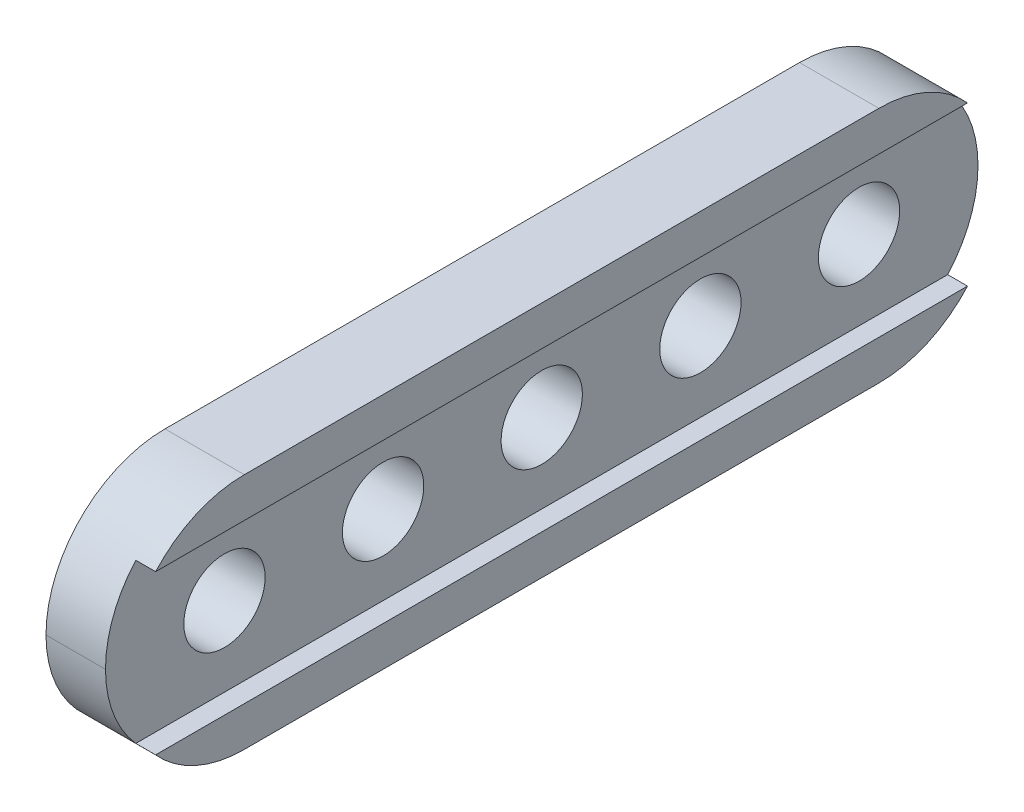
ISO-10303-21;
HEADER;
FILE_DESCRIPTION(('STEP AP214'),'2;1');
FILE_NAME('part.step','',(''),(''),'','','');
FILE_SCHEMA(('AUTOMOTIVE_DESIGN { 1 0 10303 214 1 1 1 1 }'));
ENDSEC;
DATA;
#1=APPLICATION_CONTEXT('core data for automotive mechanical design processes');
#2=APPLICATION_PROTOCOL_DEFINITION('international standard','automotive_design',2000,#1);
#3=PRODUCT_CONTEXT('',#1,'mechanical');
#4=PRODUCT('Part','Part','',(#3));
#5=PRODUCT_RELATED_PRODUCT_CATEGORY('part','',(#4));
#6=PRODUCT_DEFINITION_FORMATION('','',#4);
#7=PRODUCT_DEFINITION_CONTEXT('part definition',#1,'design');
#8=PRODUCT_DEFINITION('design','',#6,#7);
#9=PRODUCT_DEFINITION_SHAPE('','',#8);
#10=(LENGTH_UNIT() NAMED_UNIT(*) SI_UNIT(.MILLI.,.METRE.));
#11=(NAMED_UNIT(*) PLANE_ANGLE_UNIT() SI_UNIT($,.RADIAN.));
#12=(NAMED_UNIT(*) SI_UNIT($,.STERADIAN.) SOLID_ANGLE_UNIT());
#13=UNCERTAINTY_MEASURE_WITH_UNIT(LENGTH_MEASURE(1.E-05),#10,'distance_accuracy_value','');
#14=(GEOMETRIC_REPRESENTATION_CONTEXT(3) GLOBAL_UNCERTAINTY_ASSIGNED_CONTEXT((#13)) GLOBAL_UNIT_ASSIGNED_CONTEXT((#10,
#11,#12)) REPRESENTATION_CONTEXT('',''));
#15=CARTESIAN_POINT('',(0.,0.,0.));
#16=DIRECTION('',(0.,0.,1.));
#17=DIRECTION('',(1.,0.,0.));
#18=AXIS2_PLACEMENT_3D('',#15,#16,#17);
#19=CARTESIAN_POINT('',(4.,6.,-22.));
#20=DIRECTION('',(-1.,0.,0.));
#21=DIRECTION('',(0.,-1.,0.));
#22=AXIS2_PLACEMENT_3D('',#19,#20,#21);
#23=CYLINDRICAL_SURFACE('',#22,2.05);
#24=CARTESIAN_POINT('',(3.,6.,-22.));
#25=DIRECTION('',(1.,0.,0.));
#26=DIRECTION('',(0.,1.,0.));
#27=AXIS2_PLACEMENT_3D('',#24,#25,#26);
#28=CIRCLE('',#27,2.05);
#29=CARTESIAN_POINT('',(3.,8.05,-22.));
#30=VERTEX_POINT('',#29);
#31=EDGE_CURVE('E41',#30,#30,#28,.T.);
#32=ORIENTED_EDGE('',*,*,#31,.T.);
#33=EDGE_LOOP('',(#32));
#34=FACE_BOUND('',#33,.T.);
#35=CARTESIAN_POINT('',(0.,6.,-22.));
#36=DIRECTION('',(-1.,0.,0.));
#37=DIRECTION('',(0.,-1.,0.));
#38=AXIS2_PLACEMENT_3D('',#35,#36,#37);
#39=CIRCLE('',#38,2.05);
#40=CARTESIAN_POINT('',(0.,3.95,-22.));
#41=VERTEX_POINT('',#40);
#42=EDGE_CURVE('E11',#41,#41,#39,.T.);
#43=ORIENTED_EDGE('',*,*,#42,.T.);
#44=EDGE_LOOP('',(#43));
#45=FACE_BOUND('',#44,.T.);
#46=ADVANCED_FACE('F33',(#34,#45),#23,.F.);
#47=CARTESIAN_POINT('',(0.,0.,-44.));
#48=DIRECTION('',(-1.,0.,0.));
#49=DIRECTION('',(0.,-1.,0.));
#50=AXIS2_PLACEMENT_3D('',#47,#48,#49);
#51=PLANE('',#50);
#52=CARTESIAN_POINT('',(0.,6.,-14.));
#53=DIRECTION('',(1.,0.,0.));
#54=DIRECTION('',(0.,-1.,0.));
#55=AXIS2_PLACEMENT_3D('',#52,#53,#54);
#56=CIRCLE('',#55,2.05);
#57=CARTESIAN_POINT('',(0.,3.95,-14.));
#58=VERTEX_POINT('',#57);
#59=EDGE_CURVE('E194',#58,#58,#56,.T.);
#60=ORIENTED_EDGE('',*,*,#59,.T.);
#61=EDGE_LOOP('',(#60));
#62=FACE_BOUND('',#61,.T.);
#63=CARTESIAN_POINT('',(0.,6.,-6.));
#64=DIRECTION('',(1.,0.,0.));
#65=DIRECTION('',(0.,-1.,0.));
#66=AXIS2_PLACEMENT_3D('',#63,#64,#65);
#67=CIRCLE('',#66,2.05);
#68=CARTESIAN_POINT('',(0.,3.95,-6.));
#69=VERTEX_POINT('',#68);
#70=EDGE_CURVE('E183',#69,#69,#67,.T.);
#71=ORIENTED_EDGE('',*,*,#70,.T.);
#72=EDGE_LOOP('',(#71));
#73=FACE_BOUND('',#72,.T.);
#74=CARTESIAN_POINT('',(0.,6.,-30.));
#75=DIRECTION('',(-1.,0.,0.));
#76=DIRECTION('',(0.,-1.,0.));
#77=AXIS2_PLACEMENT_3D('',#74,#75,#76);
#78=CIRCLE('',#77,2.05);
#79=CARTESIAN_POINT('',(0.,3.95,-30.));
#80=VERTEX_POINT('',#79);
#81=EDGE_CURVE('E187',#80,#80,#78,.T.);
#82=ORIENTED_EDGE('',*,*,#81,.F.);
#83=EDGE_LOOP('',(#82));
#84=FACE_BOUND('',#83,.T.);
#85=CARTESIAN_POINT('',(0.,6.,-38.));
#86=DIRECTION('',(-1.,0.,0.));
#87=DIRECTION('',(0.,-1.,0.));
#88=AXIS2_PLACEMENT_3D('',#85,#86,#87);
#89=CIRCLE('',#88,2.05);
#90=CARTESIAN_POINT('',(0.,3.95,-38.));
#91=VERTEX_POINT('',#90);
#92=EDGE_CURVE('E178',#91,#91,#89,.T.);
#93=ORIENTED_EDGE('',*,*,#92,.F.);
#94=EDGE_LOOP('',(#93));
#95=FACE_BOUND('',#94,.T.);
#96=CARTESIAN_POINT('',(0.,6.,-6.));
#97=DIRECTION('',(-1.,0.,0.));
#98=DIRECTION('',(0.,-1.,0.));
#99=AXIS2_PLACEMENT_3D('',#96,#97,#98);
#100=CIRCLE('',#99,6.);
#101=CARTESIAN_POINT('',(0.,0.,-6.));
#102=VERTEX_POINT('',#101);
#103=CARTESIAN_POINT('',(0.,6.,0.));
#104=VERTEX_POINT('',#103);
#105=EDGE_CURVE('E114',#102,#104,#100,.T.);
#106=ORIENTED_EDGE('',*,*,#105,.T.);
#107=CARTESIAN_POINT('',(0.,6.,-6.));
#108=DIRECTION('',(-1.,0.,0.));
#109=DIRECTION('',(0.,-1.,0.));
#110=AXIS2_PLACEMENT_3D('',#107,#108,#109);
#111=CIRCLE('',#110,6.);
#112=CARTESIAN_POINT('',(0.,12.,-6.));
#113=VERTEX_POINT('',#112);
#114=EDGE_CURVE('E120',#104,#113,#111,.T.);
#115=ORIENTED_EDGE('',*,*,#114,.T.);
#116=DIRECTION('',(0.,0.,1.));
#117=VECTOR('',#116,1.);
#118=CARTESIAN_POINT('',(0.,12.,-44.));
#119=LINE('',#118,#117);
#120=CARTESIAN_POINT('',(0.,12.,-38.));
#121=VERTEX_POINT('',#120);
#122=EDGE_CURVE('E201',#121,#113,#119,.T.);
#123=ORIENTED_EDGE('',*,*,#122,.F.);
#124=CARTESIAN_POINT('',(0.,6.,-38.));
#125=DIRECTION('',(-1.,0.,0.));
#126=DIRECTION('',(0.,-1.,0.));
#127=AXIS2_PLACEMENT_3D('',#124,#125,#126);
#128=CIRCLE('',#127,6.);
#129=CARTESIAN_POINT('',(0.,6.,-44.));
#130=VERTEX_POINT('',#129);
#131=EDGE_CURVE('E203',#121,#130,#128,.T.);
#132=ORIENTED_EDGE('',*,*,#131,.T.);
#133=CARTESIAN_POINT('',(0.,6.,-38.));
#134=DIRECTION('',(-1.,0.,0.));
#135=DIRECTION('',(0.,-1.,0.));
#136=AXIS2_PLACEMENT_3D('',#133,#134,#135);
#137=CIRCLE('',#136,6.);
#138=CARTESIAN_POINT('',(0.,0.,-38.));
#139=VERTEX_POINT('',#138);
#140=EDGE_CURVE('E126',#130,#139,#137,.T.);
#141=ORIENTED_EDGE('',*,*,#140,.T.);
#142=DIRECTION('',(0.,0.,1.));
#143=VECTOR('',#142,1.);
#144=CARTESIAN_POINT('',(0.,0.,-44.));
#145=LINE('',#144,#143);
#146=EDGE_CURVE('E123',#139,#102,#145,.T.);
#147=ORIENTED_EDGE('',*,*,#146,.T.);
#148=EDGE_LOOP('',(#106,#115,#123,#132,#141,#147));
#149=FACE_BOUND('',#148,.T.);
#150=ORIENTED_EDGE('',*,*,#42,.F.);
#151=EDGE_LOOP('',(#150));
#152=FACE_BOUND('',#151,.T.);
#153=ADVANCED_FACE('F116',(#62,#73,#84,#95,#149,#152),#51,.T.);
#154=CARTESIAN_POINT('',(0.,12.,-44.));
#155=DIRECTION('',(0.,1.,0.));
#156=DIRECTION('',(0.,0.,1.));
#157=AXIS2_PLACEMENT_3D('',#154,#155,#156);
#158=PLANE('',#157);
#159=ORIENTED_EDGE('',*,*,#122,.T.);
#160=DIRECTION('',(-1.,0.,0.));
#161=VECTOR('',#160,1.);
#162=CARTESIAN_POINT('',(4.,12.,-6.));
#163=LINE('',#162,#161);
#164=CARTESIAN_POINT('',(4.,12.,-6.));
#165=VERTEX_POINT('',#164);
#166=EDGE_CURVE('E141',#113,#165,#163,.F.);
#167=ORIENTED_EDGE('',*,*,#166,.T.);
#168=DIRECTION('',(0.,0.,1.));
#169=VECTOR('',#168,1.);
#170=CARTESIAN_POINT('',(4.,12.,-44.));
#171=LINE('',#170,#169);
#172=CARTESIAN_POINT('',(4.,12.,-38.));
#173=VERTEX_POINT('',#172);
#174=EDGE_CURVE('E204',#173,#165,#171,.T.);
#175=ORIENTED_EDGE('',*,*,#174,.F.);
#176=DIRECTION('',(-1.,0.,0.));
#177=VECTOR('',#176,1.);
#178=CARTESIAN_POINT('',(0.,12.,-38.));
#179=LINE('',#178,#177);
#180=EDGE_CURVE('E142',#173,#121,#179,.T.);
#181=ORIENTED_EDGE('',*,*,#180,.T.);
#182=EDGE_LOOP('',(#159,#167,#175,#181));
#183=FACE_BOUND('',#182,.T.);
#184=ADVANCED_FACE('F245',(#183),#158,.T.);
#185=CARTESIAN_POINT('',(4.,10.,-44.));
#186=DIRECTION('',(1.,0.,0.));
#187=DIRECTION('',(0.,1.,0.));
#188=AXIS2_PLACEMENT_3D('',#185,#186,#187);
#189=PLANE('',#188);
#190=ORIENTED_EDGE('',*,*,#174,.T.);
#191=CARTESIAN_POINT('',(4.,6.,-6.));
#192=DIRECTION('',(1.,0.,0.));
#193=DIRECTION('',(0.,1.,0.));
#194=AXIS2_PLACEMENT_3D('',#191,#192,#193);
#195=CIRCLE('',#194,6.);
#196=CARTESIAN_POINT('',(4.,10.,-1.52786404500042));
#197=VERTEX_POINT('',#196);
#198=EDGE_CURVE('E150',#165,#197,#195,.T.);
#199=ORIENTED_EDGE('',*,*,#198,.T.);
#200=DIRECTION('',(0.,0.,1.));
#201=VECTOR('',#200,1.);
#202=CARTESIAN_POINT('',(4.,10.,-44.));
#203=LINE('',#202,#201);
#204=CARTESIAN_POINT('',(4.,10.,-42.4721359549996));
#205=VERTEX_POINT('',#204);
#206=EDGE_CURVE('E207',#205,#197,#203,.T.);
#207=ORIENTED_EDGE('',*,*,#206,.F.);
#208=CARTESIAN_POINT('',(4.,6.,-38.));
#209=DIRECTION('',(1.,0.,0.));
#210=DIRECTION('',(0.,1.,0.));
#211=AXIS2_PLACEMENT_3D('',#208,#209,#210);
#212=CIRCLE('',#211,6.);
#213=EDGE_CURVE('E148',#205,#173,#212,.T.);
#214=ORIENTED_EDGE('',*,*,#213,.T.);
#215=EDGE_LOOP('',(#190,#199,#207,#214));
#216=FACE_BOUND('',#215,.T.);
#217=ADVANCED_FACE('F265',(#216),#189,.T.);
#218=CARTESIAN_POINT('',(4.,10.,-44.));
#219=DIRECTION('',(0.,-1.,0.));
#220=DIRECTION('',(1.,0.,0.));
#221=AXIS2_PLACEMENT_3D('',#218,#219,#220);
#222=PLANE('',#221);
#223=ORIENTED_EDGE('',*,*,#206,.T.);
#224=DIRECTION('',(1.,0.,0.));
#225=VECTOR('',#224,1.);
#226=CARTESIAN_POINT('',(4.,10.,-1.52786404500042));
#227=LINE('',#226,#225);
#228=CARTESIAN_POINT('',(3.,10.,-1.52786404500042));
#229=VERTEX_POINT('',#228);
#230=EDGE_CURVE('E154',#197,#229,#227,.F.);
#231=ORIENTED_EDGE('',*,*,#230,.T.);
#232=DIRECTION('',(0.,0.,1.));
#233=VECTOR('',#232,1.);
#234=CARTESIAN_POINT('',(3.,10.,-44.));
#235=LINE('',#234,#233);
#236=CARTESIAN_POINT('',(3.,10.,-42.4721359549996));
#237=VERTEX_POINT('',#236);
#238=EDGE_CURVE('E210',#237,#229,#235,.T.);
#239=ORIENTED_EDGE('',*,*,#238,.F.);
#240=DIRECTION('',(-1.,0.,0.));
#241=VECTOR('',#240,1.);
#242=CARTESIAN_POINT('',(3.,10.,-42.4721359549996));
#243=LINE('',#242,#241);
#244=EDGE_CURVE('E152',#237,#205,#243,.F.);
#245=ORIENTED_EDGE('',*,*,#244,.T.);
#246=EDGE_LOOP('',(#223,#231,#239,#245));
#247=FACE_BOUND('',#246,.T.);
#248=ADVANCED_FACE('F255',(#247),#222,.T.);
#249=CARTESIAN_POINT('',(3.,10.,-44.));
#250=DIRECTION('',(1.,0.,0.));
#251=DIRECTION('',(0.,1.,0.));
#252=AXIS2_PLACEMENT_3D('',#249,#250,#251);
#253=PLANE('',#252);
#254=CARTESIAN_POINT('',(3.,6.,-14.));
#255=DIRECTION('',(1.,0.,0.));
#256=DIRECTION('',(0.,1.,0.));
#257=AXIS2_PLACEMENT_3D('',#254,#255,#256);
#258=CIRCLE('',#257,2.05);
#259=CARTESIAN_POINT('',(3.,8.05,-14.));
#260=VERTEX_POINT('',#259);
#261=EDGE_CURVE('E36',#260,#260,#258,.F.);
#262=ORIENTED_EDGE('',*,*,#261,.T.);
#263=EDGE_LOOP('',(#262));
#264=FACE_BOUND('',#263,.T.);
#265=CARTESIAN_POINT('',(3.,6.,-6.));
#266=DIRECTION('',(1.,0.,0.));
#267=DIRECTION('',(0.,1.,0.));
#268=AXIS2_PLACEMENT_3D('',#265,#266,#267);
#269=CIRCLE('',#268,2.05);
#270=CARTESIAN_POINT('',(3.,8.05,-6.));
#271=VERTEX_POINT('',#270);
#272=EDGE_CURVE('E180',#271,#271,#269,.F.);
#273=ORIENTED_EDGE('',*,*,#272,.T.);
#274=EDGE_LOOP('',(#273));
#275=FACE_BOUND('',#274,.T.);
#276=CARTESIAN_POINT('',(3.,6.,-30.));
#277=DIRECTION('',(1.,0.,0.));
#278=DIRECTION('',(0.,1.,0.));
#279=AXIS2_PLACEMENT_3D('',#276,#277,#278);
#280=CIRCLE('',#279,2.05);
#281=CARTESIAN_POINT('',(3.,8.05,-30.));
#282=VERTEX_POINT('',#281);
#283=EDGE_CURVE('E182',#282,#282,#280,.T.);
#284=ORIENTED_EDGE('',*,*,#283,.F.);
#285=EDGE_LOOP('',(#284));
#286=FACE_BOUND('',#285,.T.);
#287=CARTESIAN_POINT('',(3.,6.,-38.));
#288=DIRECTION('',(1.,0.,0.));
#289=DIRECTION('',(0.,1.,0.));
#290=AXIS2_PLACEMENT_3D('',#287,#288,#289);
#291=CIRCLE('',#290,2.05);
#292=CARTESIAN_POINT('',(3.,8.05,-38.));
#293=VERTEX_POINT('',#292);
#294=EDGE_CURVE('E175',#293,#293,#291,.T.);
#295=ORIENTED_EDGE('',*,*,#294,.F.);
#296=EDGE_LOOP('',(#295));
#297=FACE_BOUND('',#296,.T.);
#298=ORIENTED_EDGE('',*,*,#238,.T.);
#299=CARTESIAN_POINT('',(3.,6.,-6.));
#300=DIRECTION('',(1.,0.,0.));
#301=DIRECTION('',(0.,1.,0.));
#302=AXIS2_PLACEMENT_3D('',#299,#300,#301);
#303=CIRCLE('',#302,6.);
#304=CARTESIAN_POINT('',(3.,6.,0.));
#305=VERTEX_POINT('',#304);
#306=EDGE_CURVE('E161',#229,#305,#303,.T.);
#307=ORIENTED_EDGE('',*,*,#306,.T.);
#308=CARTESIAN_POINT('',(3.,6.,-6.));
#309=DIRECTION('',(1.,0.,0.));
#310=DIRECTION('',(0.,1.,0.));
#311=AXIS2_PLACEMENT_3D('',#308,#309,#310);
#312=CIRCLE('',#311,6.);
#313=CARTESIAN_POINT('',(3.,2.,-1.52786404500042));
#314=VERTEX_POINT('',#313);
#315=EDGE_CURVE('E133',#305,#314,#312,.T.);
#316=ORIENTED_EDGE('',*,*,#315,.T.);
#317=DIRECTION('',(0.,0.,1.));
#318=VECTOR('',#317,1.);
#319=CARTESIAN_POINT('',(3.,2.,-44.));
#320=LINE('',#319,#318);
#321=CARTESIAN_POINT('',(3.,2.,-42.4721359549996));
#322=VERTEX_POINT('',#321);
#323=EDGE_CURVE('E213',#322,#314,#320,.T.);
#324=ORIENTED_EDGE('',*,*,#323,.F.);
#325=CARTESIAN_POINT('',(3.,6.,-38.));
#326=DIRECTION('',(1.,0.,0.));
#327=DIRECTION('',(0.,1.,0.));
#328=AXIS2_PLACEMENT_3D('',#325,#326,#327);
#329=CIRCLE('',#328,6.);
#330=CARTESIAN_POINT('',(3.,6.,-44.));
#331=VERTEX_POINT('',#330);
#332=EDGE_CURVE('E158',#322,#331,#329,.T.);
#333=ORIENTED_EDGE('',*,*,#332,.T.);
#334=CARTESIAN_POINT('',(3.,6.,-38.));
#335=DIRECTION('',(1.,0.,0.));
#336=DIRECTION('',(0.,1.,0.));
#337=AXIS2_PLACEMENT_3D('',#334,#335,#336);
#338=CIRCLE('',#337,6.);
#339=EDGE_CURVE('E156',#331,#237,#338,.T.);
#340=ORIENTED_EDGE('',*,*,#339,.T.);
#341=EDGE_LOOP('',(#298,#307,#316,#324,#333,#340));
#342=FACE_BOUND('',#341,.T.);
#343=ORIENTED_EDGE('',*,*,#31,.F.);
#344=EDGE_LOOP('',(#343));
#345=FACE_BOUND('',#344,.T.);
#346=ADVANCED_FACE('F252',(#264,#275,#286,#297,#342,#345),#253,.T.);
#347=CARTESIAN_POINT('',(4.,2.,-44.));
#348=DIRECTION('',(0.,1.,0.));
#349=DIRECTION('',(-1.,0.,0.));
#350=AXIS2_PLACEMENT_3D('',#347,#348,#349);
#351=PLANE('',#350);
#352=ORIENTED_EDGE('',*,*,#323,.T.);
#353=DIRECTION('',(-1.,0.,0.));
#354=VECTOR('',#353,1.);
#355=CARTESIAN_POINT('',(3.,2.,-1.52786404500042));
#356=LINE('',#355,#354);
#357=CARTESIAN_POINT('',(4.,2.,-1.52786404500042));
#358=VERTEX_POINT('',#357);
#359=EDGE_CURVE('E165',#314,#358,#356,.F.);
#360=ORIENTED_EDGE('',*,*,#359,.T.);
#361=DIRECTION('',(0.,0.,1.));
#362=VECTOR('',#361,1.);
#363=CARTESIAN_POINT('',(4.,2.,-44.));
#364=LINE('',#363,#362);
#365=CARTESIAN_POINT('',(4.,2.,-42.4721359549996));
#366=VERTEX_POINT('',#365);
#367=EDGE_CURVE('E216',#366,#358,#364,.T.);
#368=ORIENTED_EDGE('',*,*,#367,.F.);
#369=DIRECTION('',(1.,0.,0.));
#370=VECTOR('',#369,1.);
#371=CARTESIAN_POINT('',(4.,2.,-42.4721359549996));
#372=LINE('',#371,#370);
#373=EDGE_CURVE('E163',#366,#322,#372,.F.);
#374=ORIENTED_EDGE('',*,*,#373,.T.);
#375=EDGE_LOOP('',(#352,#360,#368,#374));
#376=FACE_BOUND('',#375,.T.);
#377=ADVANCED_FACE('F254',(#376),#351,.T.);
#378=CARTESIAN_POINT('',(4.,0.,-44.));
#379=DIRECTION('',(1.,0.,0.));
#380=DIRECTION('',(0.,1.,0.));
#381=AXIS2_PLACEMENT_3D('',#378,#379,#380);
#382=PLANE('',#381);
#383=ORIENTED_EDGE('',*,*,#367,.T.);
#384=CARTESIAN_POINT('',(4.,6.,-6.));
#385=DIRECTION('',(1.,0.,0.));
#386=DIRECTION('',(0.,1.,0.));
#387=AXIS2_PLACEMENT_3D('',#384,#385,#386);
#388=CIRCLE('',#387,6.);
#389=CARTESIAN_POINT('',(4.,0.,-6.));
#390=VERTEX_POINT('',#389);
#391=EDGE_CURVE('E49',#358,#390,#388,.T.);
#392=ORIENTED_EDGE('',*,*,#391,.T.);
#393=DIRECTION('',(0.,0.,1.));
#394=VECTOR('',#393,1.);
#395=CARTESIAN_POINT('',(4.,0.,-44.));
#396=LINE('',#395,#394);
#397=CARTESIAN_POINT('',(4.,0.,-38.));
#398=VERTEX_POINT('',#397);
#399=EDGE_CURVE('E218',#398,#390,#396,.T.);
#400=ORIENTED_EDGE('',*,*,#399,.F.);
#401=CARTESIAN_POINT('',(4.,6.,-38.));
#402=DIRECTION('',(1.,0.,0.));
#403=DIRECTION('',(0.,1.,0.));
#404=AXIS2_PLACEMENT_3D('',#401,#402,#403);
#405=CIRCLE('',#404,6.);
#406=EDGE_CURVE('E57',#398,#366,#405,.T.);
#407=ORIENTED_EDGE('',*,*,#406,.T.);
#408=EDGE_LOOP('',(#383,#392,#400,#407));
#409=FACE_BOUND('',#408,.T.);
#410=ADVANCED_FACE('F262',(#409),#382,.T.);
#411=CARTESIAN_POINT('',(0.,0.,-44.));
#412=DIRECTION('',(0.,-1.,0.));
#413=DIRECTION('',(0.,0.,-1.));
#414=AXIS2_PLACEMENT_3D('',#411,#412,#413);
#415=PLANE('',#414);
#416=ORIENTED_EDGE('',*,*,#399,.T.);
#417=DIRECTION('',(1.,0.,0.));
#418=VECTOR('',#417,1.);
#419=CARTESIAN_POINT('',(0.,0.,-6.));
#420=LINE('',#419,#418);
#421=EDGE_CURVE('E171',#390,#102,#420,.F.);
#422=ORIENTED_EDGE('',*,*,#421,.T.);
#423=ORIENTED_EDGE('',*,*,#146,.F.);
#424=DIRECTION('',(1.,0.,0.));
#425=VECTOR('',#424,1.);
#426=CARTESIAN_POINT('',(0.,0.,-38.));
#427=LINE('',#426,#425);
#428=EDGE_CURVE('E169',#139,#398,#427,.T.);
#429=ORIENTED_EDGE('',*,*,#428,.T.);
#430=EDGE_LOOP('',(#416,#422,#423,#429));
#431=FACE_BOUND('',#430,.T.);
#432=ADVANCED_FACE('F225',(#431),#415,.T.);
#433=CARTESIAN_POINT('',(0.,6.,-6.));
#434=DIRECTION('',(-1.,0.,0.));
#435=DIRECTION('',(0.,0.,1.));
#436=AXIS2_PLACEMENT_3D('',#433,#434,#435);
#437=CYLINDRICAL_SURFACE('',#436,6.);
#438=ORIENTED_EDGE('',*,*,#359,.F.);
#439=ORIENTED_EDGE('',*,*,#315,.F.);
#440=DIRECTION('',(1.,0.,0.));
#441=VECTOR('',#440,1.);
#442=CARTESIAN_POINT('',(4.,6.,0.));
#443=LINE('',#442,#441);
#444=EDGE_CURVE('E130',#104,#305,#443,.T.);
#445=ORIENTED_EDGE('',*,*,#444,.F.);
#446=ORIENTED_EDGE('',*,*,#105,.F.);
#447=ORIENTED_EDGE('',*,*,#421,.F.);
#448=ORIENTED_EDGE('',*,*,#391,.F.);
#449=EDGE_LOOP('',(#438,#439,#445,#446,#447,#448));
#450=FACE_BOUND('',#449,.T.);
#451=ADVANCED_FACE('F132',(#450),#437,.T.);
#452=CARTESIAN_POINT('',(0.,6.,-6.));
#453=DIRECTION('',(1.,0.,0.));
#454=DIRECTION('',(0.,0.,-1.));
#455=AXIS2_PLACEMENT_3D('',#452,#453,#454);
#456=CYLINDRICAL_SURFACE('',#455,6.);
#457=ORIENTED_EDGE('',*,*,#198,.F.);
#458=ORIENTED_EDGE('',*,*,#166,.F.);
#459=ORIENTED_EDGE('',*,*,#114,.F.);
#460=ORIENTED_EDGE('',*,*,#444,.T.);
#461=ORIENTED_EDGE('',*,*,#306,.F.);
#462=ORIENTED_EDGE('',*,*,#230,.F.);
#463=EDGE_LOOP('',(#457,#458,#459,#460,#461,#462));
#464=FACE_BOUND('',#463,.T.);
#465=ADVANCED_FACE('F139',(#464),#456,.T.);
#466=CARTESIAN_POINT('',(0.,6.,-38.));
#467=DIRECTION('',(-1.,0.,0.));
#468=DIRECTION('',(0.,0.,1.));
#469=AXIS2_PLACEMENT_3D('',#466,#467,#468);
#470=CYLINDRICAL_SURFACE('',#469,6.);
#471=DIRECTION('',(-1.,0.,0.));
#472=VECTOR('',#471,1.);
#473=CARTESIAN_POINT('',(0.,6.,-44.));
#474=LINE('',#473,#472);
#475=EDGE_CURVE('E136',#130,#331,#474,.F.);
#476=ORIENTED_EDGE('',*,*,#475,.F.);
#477=ORIENTED_EDGE('',*,*,#131,.F.);
#478=ORIENTED_EDGE('',*,*,#180,.F.);
#479=ORIENTED_EDGE('',*,*,#213,.F.);
#480=ORIENTED_EDGE('',*,*,#244,.F.);
#481=ORIENTED_EDGE('',*,*,#339,.F.);
#482=EDGE_LOOP('',(#476,#477,#478,#479,#480,#481));
#483=FACE_BOUND('',#482,.T.);
#484=ADVANCED_FACE('F229',(#483),#470,.T.);
#485=CARTESIAN_POINT('',(0.,6.,-38.));
#486=DIRECTION('',(1.,0.,0.));
#487=DIRECTION('',(0.,0.,-1.));
#488=AXIS2_PLACEMENT_3D('',#485,#486,#487);
#489=CYLINDRICAL_SURFACE('',#488,6.);
#490=ORIENTED_EDGE('',*,*,#140,.F.);
#491=ORIENTED_EDGE('',*,*,#475,.T.);
#492=ORIENTED_EDGE('',*,*,#332,.F.);
#493=ORIENTED_EDGE('',*,*,#373,.F.);
#494=ORIENTED_EDGE('',*,*,#406,.F.);
#495=ORIENTED_EDGE('',*,*,#428,.F.);
#496=EDGE_LOOP('',(#490,#491,#492,#493,#494,#495));
#497=FACE_BOUND('',#496,.T.);
#498=ADVANCED_FACE('F226',(#497),#489,.T.);
#499=CARTESIAN_POINT('',(4.,6.,-38.));
#500=DIRECTION('',(-1.,0.,0.));
#501=DIRECTION('',(0.,-1.,0.));
#502=AXIS2_PLACEMENT_3D('',#499,#500,#501);
#503=CYLINDRICAL_SURFACE('',#502,2.05);
#504=ORIENTED_EDGE('',*,*,#294,.T.);
#505=EDGE_LOOP('',(#504));
#506=FACE_BOUND('',#505,.T.);
#507=ORIENTED_EDGE('',*,*,#92,.T.);
#508=EDGE_LOOP('',(#507));
#509=FACE_BOUND('',#508,.T.);
#510=ADVANCED_FACE('F228',(#506,#509),#503,.F.);
#511=CARTESIAN_POINT('',(4.,6.,-30.));
#512=DIRECTION('',(-1.,0.,0.));
#513=DIRECTION('',(0.,-1.,0.));
#514=AXIS2_PLACEMENT_3D('',#511,#512,#513);
#515=CYLINDRICAL_SURFACE('',#514,2.05);
#516=ORIENTED_EDGE('',*,*,#283,.T.);
#517=EDGE_LOOP('',(#516));
#518=FACE_BOUND('',#517,.T.);
#519=ORIENTED_EDGE('',*,*,#81,.T.);
#520=EDGE_LOOP('',(#519));
#521=FACE_BOUND('',#520,.T.);
#522=ADVANCED_FACE('F235',(#518,#521),#515,.F.);
#523=CARTESIAN_POINT('',(4.,6.,-6.));
#524=DIRECTION('',(-1.,0.,0.));
#525=DIRECTION('',(0.,-1.,0.));
#526=AXIS2_PLACEMENT_3D('',#523,#524,#525);
#527=CYLINDRICAL_SURFACE('',#526,2.05);
#528=ORIENTED_EDGE('',*,*,#272,.F.);
#529=EDGE_LOOP('',(#528));
#530=FACE_BOUND('',#529,.T.);
#531=ORIENTED_EDGE('',*,*,#70,.F.);
#532=EDGE_LOOP('',(#531));
#533=FACE_BOUND('',#532,.T.);
#534=ADVANCED_FACE('F311',(#530,#533),#527,.F.);
#535=CARTESIAN_POINT('',(4.,6.,-14.));
#536=DIRECTION('',(-1.,0.,0.));
#537=DIRECTION('',(0.,-1.,0.));
#538=AXIS2_PLACEMENT_3D('',#535,#536,#537);
#539=CYLINDRICAL_SURFACE('',#538,2.05);
#540=ORIENTED_EDGE('',*,*,#261,.F.);
#541=EDGE_LOOP('',(#540));
#542=FACE_BOUND('',#541,.T.);
#543=ORIENTED_EDGE('',*,*,#59,.F.);
#544=EDGE_LOOP('',(#543));
#545=FACE_BOUND('',#544,.T.);
#546=ADVANCED_FACE('F335',(#542,#545),#539,.F.);
#547=CLOSED_SHELL('',(#46,#153,#184,#217,#248,#346,#377,#410,#432,#451,#465,#484,#498,#510,#522,
#534,#546));
#548=MANIFOLD_SOLID_BREP('B2',#547);
#549=ADVANCED_BREP_SHAPE_REPRESENTATION('',(#18,#548),#14);
#550=SHAPE_DEFINITION_REPRESENTATION(#9,#549);
ENDSEC;
END-ISO-10303-21;
